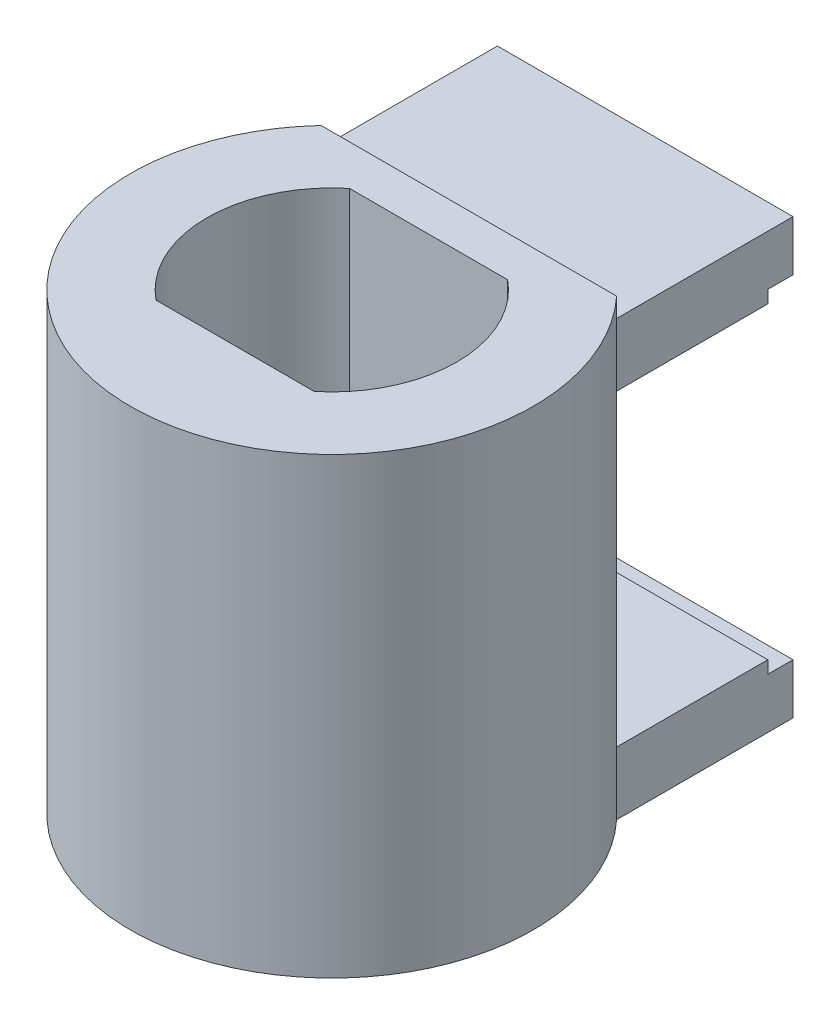
ISO-10303-21;
HEADER;
FILE_DESCRIPTION(('STEP AP214'),'2;1');
FILE_NAME('part.step','',(''),(''),'','','');
FILE_SCHEMA(('AUTOMOTIVE_DESIGN { 1 0 10303 214 1 1 1 1 }'));
ENDSEC;
DATA;
#1=APPLICATION_CONTEXT('core data for automotive mechanical design processes');
#2=APPLICATION_PROTOCOL_DEFINITION('international standard','automotive_design',2000,#1);
#3=PRODUCT_CONTEXT('',#1,'mechanical');
#4=PRODUCT('Part','Part','',(#3));
#5=PRODUCT_RELATED_PRODUCT_CATEGORY('part','',(#4));
#6=PRODUCT_DEFINITION_FORMATION('','',#4);
#7=PRODUCT_DEFINITION_CONTEXT('part definition',#1,'design');
#8=PRODUCT_DEFINITION('design','',#6,#7);
#9=PRODUCT_DEFINITION_SHAPE('','',#8);
#10=(LENGTH_UNIT() NAMED_UNIT(*) SI_UNIT(.MILLI.,.METRE.));
#11=(NAMED_UNIT(*) PLANE_ANGLE_UNIT() SI_UNIT($,.RADIAN.));
#12=(NAMED_UNIT(*) SI_UNIT($,.STERADIAN.) SOLID_ANGLE_UNIT());
#13=UNCERTAINTY_MEASURE_WITH_UNIT(LENGTH_MEASURE(1.E-05),#10,'distance_accuracy_value','');
#14=(GEOMETRIC_REPRESENTATION_CONTEXT(3) GLOBAL_UNCERTAINTY_ASSIGNED_CONTEXT((#13)) GLOBAL_UNIT_ASSIGNED_CONTEXT((#10,
#11,#12)) REPRESENTATION_CONTEXT('',''));
#15=CARTESIAN_POINT('',(0.,0.,0.));
#16=DIRECTION('',(0.,0.,1.));
#17=DIRECTION('',(1.,0.,0.));
#18=AXIS2_PLACEMENT_3D('',#15,#16,#17);
#19=CARTESIAN_POINT('',(0.,0.,-8.636));
#20=DIRECTION('',(0.,0.,-1.));
#21=DIRECTION('',(-1.,0.,0.));
#22=AXIS2_PLACEMENT_3D('',#19,#20,#21);
#23=PLANE('',#22);
#24=DIRECTION('',(0.,-1.,0.));
#25=VECTOR('',#24,1.);
#26=CARTESIAN_POINT('',(-9.31179381215027,9.525,-8.636));
#27=LINE('',#26,#25);
#28=CARTESIAN_POINT('',(-9.31179381215027,3.96875,-8.636));
#29=VERTEX_POINT('',#28);
#30=CARTESIAN_POINT('',(-9.31179381215027,23.38705,-8.636));
#31=VERTEX_POINT('',#30);
#32=EDGE_CURVE('E292',#29,#31,#27,.F.);
#33=ORIENTED_EDGE('',*,*,#32,.T.);
#34=DIRECTION('',(-1.,0.,0.));
#35=VECTOR('',#34,1.);
#36=CARTESIAN_POINT('',(9.31179381215027,23.38705,-8.636));
#37=LINE('',#36,#35);
#38=CARTESIAN_POINT('',(9.31179381215027,23.38705,-8.636));
#39=VERTEX_POINT('',#38);
#40=EDGE_CURVE('E183',#39,#31,#37,.T.);
#41=ORIENTED_EDGE('',*,*,#40,.F.);
#42=DIRECTION('',(0.,-1.,0.));
#43=VECTOR('',#42,1.);
#44=CARTESIAN_POINT('',(9.31179381215027,9.525,-8.636));
#45=LINE('',#44,#43);
#46=CARTESIAN_POINT('',(9.31179381215027,3.96875,-8.636));
#47=VERTEX_POINT('',#46);
#48=EDGE_CURVE('E55',#39,#47,#45,.T.);
#49=ORIENTED_EDGE('',*,*,#48,.T.);
#50=DIRECTION('',(1.,0.,0.));
#51=VECTOR('',#50,1.);
#52=CARTESIAN_POINT('',(9.31179381215027,3.96875,-8.636));
#53=LINE('',#52,#51);
#54=EDGE_CURVE('E189',#29,#47,#53,.T.);
#55=ORIENTED_EDGE('',*,*,#54,.F.);
#56=EDGE_LOOP('',(#33,#41,#49,#55));
#57=FACE_BOUND('',#56,.T.);
#58=ADVANCED_FACE('F39',(#57),#23,.T.);
#59=CARTESIAN_POINT('',(9.31179381215027,3.175,-19.7485));
#60=DIRECTION('',(0.,-1.,0.));
#61=DIRECTION('',(0.,0.,-1.));
#62=AXIS2_PLACEMENT_3D('',#59,#60,#61);
#63=PLANE('',#62);
#64=DIRECTION('',(-1.,0.,0.));
#65=VECTOR('',#64,1.);
#66=CARTESIAN_POINT('',(9.31179381215027,3.175,-18.161));
#67=LINE('',#66,#65);
#68=CARTESIAN_POINT('',(9.31179381215027,3.175,-18.161));
#69=VERTEX_POINT('',#68);
#70=CARTESIAN_POINT('',(-9.31179381215027,3.175,-18.161));
#71=VERTEX_POINT('',#70);
#72=EDGE_CURVE('E202',#69,#71,#67,.T.);
#73=ORIENTED_EDGE('',*,*,#72,.F.);
#74=DIRECTION('',(0.,0.,1.));
#75=VECTOR('',#74,1.);
#76=CARTESIAN_POINT('',(9.31179381215027,3.175,-19.7485));
#77=LINE('',#76,#75);
#78=CARTESIAN_POINT('',(9.31179381215027,3.175,-19.7485));
#79=VERTEX_POINT('',#78);
#80=EDGE_CURVE('E269',#79,#69,#77,.T.);
#81=ORIENTED_EDGE('',*,*,#80,.F.);
#82=DIRECTION('',(1.,0.,0.));
#83=VECTOR('',#82,1.);
#84=CARTESIAN_POINT('',(9.31179381215027,3.175,-19.7485));
#85=LINE('',#84,#83);
#86=CARTESIAN_POINT('',(-9.31179381215027,3.175,-19.7485));
#87=VERTEX_POINT('',#86);
#88=EDGE_CURVE('E266',#87,#79,#85,.T.);
#89=ORIENTED_EDGE('',*,*,#88,.F.);
#90=DIRECTION('',(0.,0.,1.));
#91=VECTOR('',#90,1.);
#92=CARTESIAN_POINT('',(-9.31179381215027,3.175,-19.7485));
#93=LINE('',#92,#91);
#94=EDGE_CURVE('E276',#87,#71,#93,.T.);
#95=ORIENTED_EDGE('',*,*,#94,.T.);
#96=EDGE_LOOP('',(#73,#81,#89,#95));
#97=FACE_BOUND('',#96,.T.);
#98=ADVANCED_FACE('F409',(#97),#63,.F.);
#99=CARTESIAN_POINT('',(9.31179381215027,28.575,-8.636));
#100=VERTEX_POINT('',#99);
#101=CARTESIAN_POINT('',(9.31179381215027,27.3558,-8.636));
#102=VERTEX_POINT('',#101);
#103=EDGE_CURVE('E293',#100,#102,#45,.T.);
#104=ORIENTED_EDGE('',*,*,#103,.T.);
#105=DIRECTION('',(1.,0.,0.));
#106=VECTOR('',#105,1.);
#107=CARTESIAN_POINT('',(9.31179381215027,27.3558,-8.636));
#108=LINE('',#107,#106);
#109=CARTESIAN_POINT('',(-9.31179381215027,27.3558,-8.636));
#110=VERTEX_POINT('',#109);
#111=EDGE_CURVE('E226',#110,#102,#108,.T.);
#112=ORIENTED_EDGE('',*,*,#111,.F.);
#113=CARTESIAN_POINT('',(-9.31179381215027,28.575,-8.636));
#114=VERTEX_POINT('',#113);
#115=EDGE_CURVE('E289',#110,#114,#27,.F.);
#116=ORIENTED_EDGE('',*,*,#115,.T.);
#117=DIRECTION('',(-1.,0.,0.));
#118=VECTOR('',#117,1.);
#119=CARTESIAN_POINT('',(0.,28.575,-8.636));
#120=LINE('',#119,#118);
#121=EDGE_CURVE('E11',#100,#114,#120,.T.);
#122=ORIENTED_EDGE('',*,*,#121,.F.);
#123=EDGE_LOOP('',(#104,#112,#116,#122));
#124=FACE_BOUND('',#123,.T.);
#125=ADVANCED_FACE('F411',(#124),#23,.T.);
#126=CARTESIAN_POINT('',(0.,9.525,0.));
#127=DIRECTION('',(0.,-1.,0.));
#128=DIRECTION('',(0.,0.,-1.));
#129=AXIS2_PLACEMENT_3D('',#126,#127,#128);
#130=CYLINDRICAL_SURFACE('',#129,12.7);
#131=ORIENTED_EDGE('',*,*,#103,.F.);
#132=CARTESIAN_POINT('',(0.,28.575,0.));
#133=DIRECTION('',(0.,1.,0.));
#134=DIRECTION('',(0.,0.,1.));
#135=AXIS2_PLACEMENT_3D('',#132,#133,#134);
#136=CIRCLE('',#135,12.7);
#137=EDGE_CURVE('E355',#114,#100,#136,.T.);
#138=ORIENTED_EDGE('',*,*,#137,.F.);
#139=ORIENTED_EDGE('',*,*,#115,.F.);
#140=DIRECTION('',(0.,1.,0.));
#141=VECTOR('',#140,1.);
#142=CARTESIAN_POINT('',(-9.31179381215027,27.3558,-8.636));
#143=LINE('',#142,#141);
#144=EDGE_CURVE('E220',#31,#110,#143,.T.);
#145=ORIENTED_EDGE('',*,*,#144,.F.);
#146=ORIENTED_EDGE('',*,*,#32,.F.);
#147=CARTESIAN_POINT('',(-9.31179381215027,0.,-8.636));
#148=VERTEX_POINT('',#147);
#149=EDGE_CURVE('E63',#148,#29,#27,.F.);
#150=ORIENTED_EDGE('',*,*,#149,.F.);
#151=CARTESIAN_POINT('',(0.,0.,0.));
#152=DIRECTION('',(0.,1.,0.));
#153=DIRECTION('',(0.,0.,1.));
#154=AXIS2_PLACEMENT_3D('',#151,#152,#153);
#155=CIRCLE('',#154,12.7);
#156=CARTESIAN_POINT('',(9.31179381215027,0.,-8.636));
#157=VERTEX_POINT('',#156);
#158=EDGE_CURVE('E285',#148,#157,#155,.T.);
#159=ORIENTED_EDGE('',*,*,#158,.T.);
#160=DIRECTION('',(0.,-1.,0.));
#161=VECTOR('',#160,1.);
#162=CARTESIAN_POINT('',(9.31179381215027,0.,-8.636));
#163=LINE('',#162,#161);
#164=EDGE_CURVE('E255',#47,#157,#163,.T.);
#165=ORIENTED_EDGE('',*,*,#164,.F.);
#166=ORIENTED_EDGE('',*,*,#48,.F.);
#167=EDGE_CURVE('E187',#102,#39,#45,.T.);
#168=ORIENTED_EDGE('',*,*,#167,.F.);
#169=EDGE_LOOP('',(#131,#138,#139,#145,#146,#150,#159,#165,#166,#168));
#170=FACE_BOUND('',#169,.T.);
#171=ADVANCED_FACE('F421',(#170),#130,.T.);
#172=CARTESIAN_POINT('',(0.,28.575,0.));
#173=DIRECTION('',(0.,1.,0.));
#174=DIRECTION('',(0.,0.,1.));
#175=AXIS2_PLACEMENT_3D('',#172,#173,#174);
#176=PLANE('',#175);
#177=DIRECTION('',(1.,0.,0.));
#178=VECTOR('',#177,1.);
#179=CARTESIAN_POINT('',(-4.98383988506854,28.575,6.096));
#180=LINE('',#179,#178);
#181=CARTESIAN_POINT('',(-4.98383988506854,28.575,6.096));
#182=VERTEX_POINT('',#181);
#183=CARTESIAN_POINT('',(4.98383988506854,28.575,6.096));
#184=VERTEX_POINT('',#183);
#185=EDGE_CURVE('E317',#182,#184,#180,.T.);
#186=ORIENTED_EDGE('',*,*,#185,.F.);
#187=CARTESIAN_POINT('',(0.,28.575,0.));
#188=DIRECTION('',(0.,1.,0.));
#189=DIRECTION('',(0.,0.,1.));
#190=AXIS2_PLACEMENT_3D('',#187,#188,#189);
#191=CIRCLE('',#190,7.874);
#192=CARTESIAN_POINT('',(-4.98383988506854,28.575,-6.096));
#193=VERTEX_POINT('',#192);
#194=EDGE_CURVE('E314',#193,#182,#191,.T.);
#195=ORIENTED_EDGE('',*,*,#194,.F.);
#196=DIRECTION('',(-1.,0.,0.));
#197=VECTOR('',#196,1.);
#198=CARTESIAN_POINT('',(-4.98383988506854,28.575,-6.096));
#199=LINE('',#198,#197);
#200=CARTESIAN_POINT('',(4.98383988506854,28.575,-6.096));
#201=VERTEX_POINT('',#200);
#202=EDGE_CURVE('E325',#201,#193,#199,.T.);
#203=ORIENTED_EDGE('',*,*,#202,.F.);
#204=CARTESIAN_POINT('',(0.,28.575,0.));
#205=DIRECTION('',(0.,1.,0.));
#206=DIRECTION('',(0.,0.,1.));
#207=AXIS2_PLACEMENT_3D('',#204,#205,#206);
#208=CIRCLE('',#207,7.874);
#209=EDGE_CURVE('E321',#184,#201,#208,.T.);
#210=ORIENTED_EDGE('',*,*,#209,.F.);
#211=EDGE_LOOP('',(#186,#195,#203,#210));
#212=FACE_BOUND('',#211,.T.);
#213=ORIENTED_EDGE('',*,*,#137,.T.);
#214=ORIENTED_EDGE('',*,*,#121,.T.);
#215=EDGE_LOOP('',(#213,#214));
#216=FACE_BOUND('',#215,.T.);
#217=ADVANCED_FACE('F377',(#212,#216),#176,.T.);
#218=CARTESIAN_POINT('',(0.,9.525,0.));
#219=DIRECTION('',(0.,1.,0.));
#220=DIRECTION('',(0.,0.,1.));
#221=AXIS2_PLACEMENT_3D('',#218,#219,#220);
#222=PLANE('',#221);
#223=CARTESIAN_POINT('',(-4.39940905122495,9.525,-0.635));
#224=DIRECTION('',(0.,1.,0.));
#225=DIRECTION('',(0.,0.,1.));
#226=AXIS2_PLACEMENT_3D('',#223,#224,#225);
#227=CIRCLE('',#226,1.143);
#228=CARTESIAN_POINT('',(-4.39940905122495,9.525,0.508));
#229=VERTEX_POINT('',#228);
#230=EDGE_CURVE('E309',#229,#229,#227,.T.);
#231=ORIENTED_EDGE('',*,*,#230,.F.);
#232=EDGE_LOOP('',(#231));
#233=FACE_BOUND('',#232,.T.);
#234=CARTESIAN_POINT('',(4.39940905122495,9.525,0.634999999999968));
#235=DIRECTION('',(0.,1.,0.));
#236=DIRECTION('',(0.,0.,1.));
#237=AXIS2_PLACEMENT_3D('',#234,#235,#236);
#238=CIRCLE('',#237,1.143);
#239=CARTESIAN_POINT('',(4.39940905122495,9.525,1.77799999999997));
#240=VERTEX_POINT('',#239);
#241=EDGE_CURVE('E302',#240,#240,#238,.T.);
#242=ORIENTED_EDGE('',*,*,#241,.F.);
#243=EDGE_LOOP('',(#242));
#244=FACE_BOUND('',#243,.T.);
#245=CARTESIAN_POINT('',(0.,9.525,0.));
#246=DIRECTION('',(0.,1.,0.));
#247=DIRECTION('',(0.,0.,1.));
#248=AXIS2_PLACEMENT_3D('',#245,#246,#247);
#249=CIRCLE('',#248,2.9718);
#250=CARTESIAN_POINT('',(0.,9.525,2.9718));
#251=VERTEX_POINT('',#250);
#252=EDGE_CURVE('E359',#251,#251,#249,.T.);
#253=ORIENTED_EDGE('',*,*,#252,.F.);
#254=EDGE_LOOP('',(#253));
#255=FACE_BOUND('',#254,.T.);
#256=DIRECTION('',(-1.,0.,0.));
#257=VECTOR('',#256,1.);
#258=CARTESIAN_POINT('',(-4.98383988506854,9.525,-6.096));
#259=LINE('',#258,#257);
#260=CARTESIAN_POINT('',(4.98383988506854,9.525,-6.096));
#261=VERTEX_POINT('',#260);
#262=CARTESIAN_POINT('',(-4.98383988506854,9.525,-6.096));
#263=VERTEX_POINT('',#262);
#264=EDGE_CURVE('E318',#261,#263,#259,.T.);
#265=ORIENTED_EDGE('',*,*,#264,.T.);
#266=CARTESIAN_POINT('',(0.,9.525,0.));
#267=DIRECTION('',(0.,1.,0.));
#268=DIRECTION('',(0.,0.,1.));
#269=AXIS2_PLACEMENT_3D('',#266,#267,#268);
#270=CIRCLE('',#269,7.874);
#271=CARTESIAN_POINT('',(-4.98383988506854,9.525,6.096));
#272=VERTEX_POINT('',#271);
#273=EDGE_CURVE('E313',#263,#272,#270,.T.);
#274=ORIENTED_EDGE('',*,*,#273,.T.);
#275=DIRECTION('',(1.,0.,0.));
#276=VECTOR('',#275,1.);
#277=CARTESIAN_POINT('',(-4.98383988506854,9.525,6.096));
#278=LINE('',#277,#276);
#279=CARTESIAN_POINT('',(4.98383988506854,9.525,6.096));
#280=VERTEX_POINT('',#279);
#281=EDGE_CURVE('E332',#272,#280,#278,.T.);
#282=ORIENTED_EDGE('',*,*,#281,.T.);
#283=CARTESIAN_POINT('',(0.,9.525,0.));
#284=DIRECTION('',(0.,1.,0.));
#285=DIRECTION('',(0.,0.,1.));
#286=AXIS2_PLACEMENT_3D('',#283,#284,#285);
#287=CIRCLE('',#286,7.874);
#288=EDGE_CURVE('E336',#280,#261,#287,.T.);
#289=ORIENTED_EDGE('',*,*,#288,.T.);
#290=EDGE_LOOP('',(#265,#274,#282,#289));
#291=FACE_BOUND('',#290,.T.);
#292=ADVANCED_FACE('F374',(#233,#244,#255,#291),#222,.T.);
#293=CARTESIAN_POINT('',(0.,0.,0.));
#294=DIRECTION('',(0.,1.,0.));
#295=DIRECTION('',(0.,0.,1.));
#296=AXIS2_PLACEMENT_3D('',#293,#294,#295);
#297=PLANE('',#296);
#298=CARTESIAN_POINT('',(-4.39940905122495,0.,-0.635));
#299=DIRECTION('',(0.,-1.,0.));
#300=DIRECTION('',(0.,0.,-1.));
#301=AXIS2_PLACEMENT_3D('',#298,#299,#300);
#302=CIRCLE('',#301,1.143);
#303=CARTESIAN_POINT('',(-4.39940905122495,0.,-1.778));
#304=VERTEX_POINT('',#303);
#305=EDGE_CURVE('E298',#304,#304,#302,.T.);
#306=ORIENTED_EDGE('',*,*,#305,.F.);
#307=EDGE_LOOP('',(#306));
#308=FACE_BOUND('',#307,.T.);
#309=CARTESIAN_POINT('',(4.39940905122495,0.,0.634999999999968));
#310=DIRECTION('',(0.,-1.,0.));
#311=DIRECTION('',(0.,0.,-1.));
#312=AXIS2_PLACEMENT_3D('',#309,#310,#311);
#313=CIRCLE('',#312,1.143);
#314=CARTESIAN_POINT('',(4.39940905122495,0.,-0.508000000000032));
#315=VERTEX_POINT('',#314);
#316=EDGE_CURVE('E297',#315,#315,#313,.T.);
#317=ORIENTED_EDGE('',*,*,#316,.F.);
#318=EDGE_LOOP('',(#317));
#319=FACE_BOUND('',#318,.T.);
#320=CARTESIAN_POINT('',(0.,0.,0.));
#321=DIRECTION('',(0.,1.,0.));
#322=DIRECTION('',(0.,0.,1.));
#323=AXIS2_PLACEMENT_3D('',#320,#321,#322);
#324=CIRCLE('',#323,2.9718);
#325=CARTESIAN_POINT('',(0.,0.,2.9718));
#326=VERTEX_POINT('',#325);
#327=EDGE_CURVE('E48',#326,#326,#324,.T.);
#328=ORIENTED_EDGE('',*,*,#327,.T.);
#329=EDGE_LOOP('',(#328));
#330=FACE_BOUND('',#329,.T.);
#331=ORIENTED_EDGE('',*,*,#158,.F.);
#332=DIRECTION('',(0.,0.,1.));
#333=VECTOR('',#332,1.);
#334=CARTESIAN_POINT('',(-9.31179381215027,0.,-19.7485));
#335=LINE('',#334,#333);
#336=CARTESIAN_POINT('',(-9.31179381215027,0.,-19.7485));
#337=VERTEX_POINT('',#336);
#338=EDGE_CURVE('E279',#337,#148,#335,.T.);
#339=ORIENTED_EDGE('',*,*,#338,.F.);
#340=DIRECTION('',(-1.,0.,0.));
#341=VECTOR('',#340,1.);
#342=CARTESIAN_POINT('',(9.31179381215027,0.,-19.7485));
#343=LINE('',#342,#341);
#344=CARTESIAN_POINT('',(9.31179381215027,0.,-19.7485));
#345=VERTEX_POINT('',#344);
#346=EDGE_CURVE('E260',#345,#337,#343,.T.);
#347=ORIENTED_EDGE('',*,*,#346,.F.);
#348=DIRECTION('',(0.,0.,1.));
#349=VECTOR('',#348,1.);
#350=CARTESIAN_POINT('',(9.31179381215027,0.,-19.7485));
#351=LINE('',#350,#349);
#352=EDGE_CURVE('E282',#345,#157,#351,.T.);
#353=ORIENTED_EDGE('',*,*,#352,.T.);
#354=EDGE_LOOP('',(#331,#339,#347,#353));
#355=FACE_BOUND('',#354,.T.);
#356=ADVANCED_FACE('F41',(#308,#319,#330,#355),#297,.F.);
#357=CARTESIAN_POINT('',(0.,6.35,0.));
#358=DIRECTION('',(0.,-1.,0.));
#359=DIRECTION('',(0.,0.,-1.));
#360=AXIS2_PLACEMENT_3D('',#357,#358,#359);
#361=CYLINDRICAL_SURFACE('',#360,2.9718);
#362=ORIENTED_EDGE('',*,*,#327,.F.);
#363=EDGE_LOOP('',(#362));
#364=FACE_BOUND('',#363,.T.);
#365=ORIENTED_EDGE('',*,*,#252,.T.);
#366=EDGE_LOOP('',(#365));
#367=FACE_BOUND('',#366,.T.);
#368=ADVANCED_FACE('F368',(#364,#367),#361,.F.);
#369=CARTESIAN_POINT('',(0.,28.575,0.));
#370=DIRECTION('',(0.,-1.,0.));
#371=DIRECTION('',(0.,0.,-1.));
#372=AXIS2_PLACEMENT_3D('',#369,#370,#371);
#373=CYLINDRICAL_SURFACE('',#372,7.874);
#374=ORIENTED_EDGE('',*,*,#273,.F.);
#375=DIRECTION('',(0.,-1.,0.));
#376=VECTOR('',#375,1.);
#377=CARTESIAN_POINT('',(-4.98383988506854,28.575,-6.096));
#378=LINE('',#377,#376);
#379=EDGE_CURVE('E328',#193,#263,#378,.T.);
#380=ORIENTED_EDGE('',*,*,#379,.F.);
#381=ORIENTED_EDGE('',*,*,#194,.T.);
#382=DIRECTION('',(0.,-1.,0.));
#383=VECTOR('',#382,1.);
#384=CARTESIAN_POINT('',(-4.98383988506854,28.575,6.096));
#385=LINE('',#384,#383);
#386=EDGE_CURVE('E351',#182,#272,#385,.T.);
#387=ORIENTED_EDGE('',*,*,#386,.T.);
#388=EDGE_LOOP('',(#374,#380,#381,#387));
#389=FACE_BOUND('',#388,.T.);
#390=ADVANCED_FACE('F371',(#389),#373,.F.);
#391=CARTESIAN_POINT('',(-4.98383988506854,28.575,6.096));
#392=DIRECTION('',(0.,0.,-1.));
#393=DIRECTION('',(-1.,0.,0.));
#394=AXIS2_PLACEMENT_3D('',#391,#392,#393);
#395=PLANE('',#394);
#396=ORIENTED_EDGE('',*,*,#281,.F.);
#397=ORIENTED_EDGE('',*,*,#386,.F.);
#398=ORIENTED_EDGE('',*,*,#185,.T.);
#399=DIRECTION('',(0.,-1.,0.));
#400=VECTOR('',#399,1.);
#401=CARTESIAN_POINT('',(4.98383988506854,28.575,6.096));
#402=LINE('',#401,#400);
#403=EDGE_CURVE('E348',#184,#280,#402,.T.);
#404=ORIENTED_EDGE('',*,*,#403,.T.);
#405=EDGE_LOOP('',(#396,#397,#398,#404));
#406=FACE_BOUND('',#405,.T.);
#407=ADVANCED_FACE('F392',(#406),#395,.T.);
#408=CARTESIAN_POINT('',(0.,28.575,0.));
#409=DIRECTION('',(0.,-1.,0.));
#410=DIRECTION('',(0.,0.,-1.));
#411=AXIS2_PLACEMENT_3D('',#408,#409,#410);
#412=CYLINDRICAL_SURFACE('',#411,7.874);
#413=ORIENTED_EDGE('',*,*,#288,.F.);
#414=ORIENTED_EDGE('',*,*,#403,.F.);
#415=ORIENTED_EDGE('',*,*,#209,.T.);
#416=DIRECTION('',(0.,-1.,0.));
#417=VECTOR('',#416,1.);
#418=CARTESIAN_POINT('',(4.98383988506854,28.575,-6.096));
#419=LINE('',#418,#417);
#420=EDGE_CURVE('E345',#201,#261,#419,.T.);
#421=ORIENTED_EDGE('',*,*,#420,.T.);
#422=EDGE_LOOP('',(#413,#414,#415,#421));
#423=FACE_BOUND('',#422,.T.);
#424=ADVANCED_FACE('F398',(#423),#412,.F.);
#425=CARTESIAN_POINT('',(-4.98383988506854,28.575,-6.096));
#426=DIRECTION('',(0.,0.,1.));
#427=DIRECTION('',(1.,0.,0.));
#428=AXIS2_PLACEMENT_3D('',#425,#426,#427);
#429=PLANE('',#428);
#430=ORIENTED_EDGE('',*,*,#264,.F.);
#431=ORIENTED_EDGE('',*,*,#420,.F.);
#432=ORIENTED_EDGE('',*,*,#202,.T.);
#433=ORIENTED_EDGE('',*,*,#379,.T.);
#434=EDGE_LOOP('',(#430,#431,#432,#433));
#435=FACE_BOUND('',#434,.T.);
#436=ADVANCED_FACE('F384',(#435),#429,.T.);
#437=CARTESIAN_POINT('',(4.39940905122495,28.575,0.634999999999968));
#438=DIRECTION('',(0.,-1.,0.));
#439=DIRECTION('',(0.,0.,-1.));
#440=AXIS2_PLACEMENT_3D('',#437,#438,#439);
#441=CYLINDRICAL_SURFACE('',#440,1.143);
#442=ORIENTED_EDGE('',*,*,#241,.T.);
#443=EDGE_LOOP('',(#442));
#444=FACE_BOUND('',#443,.T.);
#445=ORIENTED_EDGE('',*,*,#316,.T.);
#446=EDGE_LOOP('',(#445));
#447=FACE_BOUND('',#446,.T.);
#448=ADVANCED_FACE('F405',(#444,#447),#441,.F.);
#449=CARTESIAN_POINT('',(-4.39940905122495,28.575,-0.635));
#450=DIRECTION('',(0.,-1.,0.));
#451=DIRECTION('',(0.,0.,-1.));
#452=AXIS2_PLACEMENT_3D('',#449,#450,#451);
#453=CYLINDRICAL_SURFACE('',#452,1.143);
#454=ORIENTED_EDGE('',*,*,#305,.T.);
#455=EDGE_LOOP('',(#454));
#456=FACE_BOUND('',#455,.T.);
#457=ORIENTED_EDGE('',*,*,#230,.T.);
#458=EDGE_LOOP('',(#457));
#459=FACE_BOUND('',#458,.T.);
#460=ADVANCED_FACE('F469',(#456,#459),#453,.F.);
#461=CARTESIAN_POINT('',(9.31179381215027,0.,-19.7485));
#462=DIRECTION('',(-1.,0.,0.));
#463=DIRECTION('',(0.,0.,1.));
#464=AXIS2_PLACEMENT_3D('',#461,#462,#463);
#465=PLANE('',#464);
#466=ORIENTED_EDGE('',*,*,#164,.T.);
#467=ORIENTED_EDGE('',*,*,#352,.F.);
#468=DIRECTION('',(0.,-1.,0.));
#469=VECTOR('',#468,1.);
#470=CARTESIAN_POINT('',(9.31179381215027,0.,-19.7485));
#471=LINE('',#470,#469);
#472=EDGE_CURVE('E256',#79,#345,#471,.T.);
#473=ORIENTED_EDGE('',*,*,#472,.F.);
#474=ORIENTED_EDGE('',*,*,#80,.T.);
#475=DIRECTION('',(0.,-1.,0.));
#476=VECTOR('',#475,1.);
#477=CARTESIAN_POINT('',(9.31179381215027,3.175,-18.161));
#478=LINE('',#477,#476);
#479=CARTESIAN_POINT('',(9.31179381215027,3.96875,-18.161));
#480=VERTEX_POINT('',#479);
#481=EDGE_CURVE('E194',#480,#69,#478,.T.);
#482=ORIENTED_EDGE('',*,*,#481,.F.);
#483=DIRECTION('',(0.,0.,1.));
#484=VECTOR('',#483,1.);
#485=CARTESIAN_POINT('',(9.31179381215027,3.96875,-18.161));
#486=LINE('',#485,#484);
#487=EDGE_CURVE('E211',#480,#47,#486,.T.);
#488=ORIENTED_EDGE('',*,*,#487,.T.);
#489=EDGE_LOOP('',(#466,#467,#473,#474,#482,#488));
#490=FACE_BOUND('',#489,.T.);
#491=ADVANCED_FACE('F467',(#490),#465,.F.);
#492=CARTESIAN_POINT('',(-9.31179381215027,0.,-19.7485));
#493=DIRECTION('',(1.,0.,0.));
#494=DIRECTION('',(0.,0.,-1.));
#495=AXIS2_PLACEMENT_3D('',#492,#493,#494);
#496=PLANE('',#495);
#497=ORIENTED_EDGE('',*,*,#149,.T.);
#498=DIRECTION('',(0.,0.,1.));
#499=VECTOR('',#498,1.);
#500=CARTESIAN_POINT('',(-9.31179381215027,3.96875,-18.161));
#501=LINE('',#500,#499);
#502=CARTESIAN_POINT('',(-9.31179381215027,3.96875,-18.161));
#503=VERTEX_POINT('',#502);
#504=EDGE_CURVE('E216',#503,#29,#501,.T.);
#505=ORIENTED_EDGE('',*,*,#504,.F.);
#506=DIRECTION('',(0.,1.,0.));
#507=VECTOR('',#506,1.);
#508=CARTESIAN_POINT('',(-9.31179381215027,3.175,-18.161));
#509=LINE('',#508,#507);
#510=EDGE_CURVE('E206',#71,#503,#509,.T.);
#511=ORIENTED_EDGE('',*,*,#510,.F.);
#512=ORIENTED_EDGE('',*,*,#94,.F.);
#513=DIRECTION('',(0.,1.,0.));
#514=VECTOR('',#513,1.);
#515=CARTESIAN_POINT('',(-9.31179381215027,0.,-19.7485));
#516=LINE('',#515,#514);
#517=EDGE_CURVE('E263',#337,#87,#516,.T.);
#518=ORIENTED_EDGE('',*,*,#517,.F.);
#519=ORIENTED_EDGE('',*,*,#338,.T.);
#520=EDGE_LOOP('',(#497,#505,#511,#512,#518,#519));
#521=FACE_BOUND('',#520,.T.);
#522=ADVANCED_FACE('F463',(#521),#496,.F.);
#523=CARTESIAN_POINT('',(0.,0.,-19.7485));
#524=DIRECTION('',(0.,0.,1.));
#525=DIRECTION('',(1.,0.,0.));
#526=AXIS2_PLACEMENT_3D('',#523,#524,#525);
#527=PLANE('',#526);
#528=ORIENTED_EDGE('',*,*,#472,.T.);
#529=ORIENTED_EDGE('',*,*,#346,.T.);
#530=ORIENTED_EDGE('',*,*,#517,.T.);
#531=ORIENTED_EDGE('',*,*,#88,.T.);
#532=EDGE_LOOP('',(#528,#529,#530,#531));
#533=FACE_BOUND('',#532,.T.);
#534=ADVANCED_FACE('F458',(#533),#527,.F.);
#535=CARTESIAN_POINT('',(9.31179381215027,27.3558,-19.7485));
#536=DIRECTION('',(-1.,0.,0.));
#537=DIRECTION('',(0.,0.,1.));
#538=AXIS2_PLACEMENT_3D('',#535,#536,#537);
#539=PLANE('',#538);
#540=DIRECTION('',(0.,0.,1.));
#541=VECTOR('',#540,1.);
#542=CARTESIAN_POINT('',(9.31179381215027,27.3558,-19.7485));
#543=LINE('',#542,#541);
#544=CARTESIAN_POINT('',(9.31179381215027,27.3558,-19.7485));
#545=VERTEX_POINT('',#544);
#546=EDGE_CURVE('E235',#545,#102,#543,.T.);
#547=ORIENTED_EDGE('',*,*,#546,.T.);
#548=ORIENTED_EDGE('',*,*,#167,.T.);
#549=DIRECTION('',(0.,0.,1.));
#550=VECTOR('',#549,1.);
#551=CARTESIAN_POINT('',(9.31179381215027,23.38705,-18.161));
#552=LINE('',#551,#550);
#553=CARTESIAN_POINT('',(9.31179381215027,23.38705,-18.161));
#554=VERTEX_POINT('',#553);
#555=EDGE_CURVE('E165',#554,#39,#552,.T.);
#556=ORIENTED_EDGE('',*,*,#555,.F.);
#557=DIRECTION('',(0.,-1.,0.));
#558=VECTOR('',#557,1.);
#559=CARTESIAN_POINT('',(9.31179381215027,24.1808,-18.161));
#560=LINE('',#559,#558);
#561=CARTESIAN_POINT('',(9.31179381215027,24.1808,-18.161));
#562=VERTEX_POINT('',#561);
#563=EDGE_CURVE('E173',#562,#554,#560,.T.);
#564=ORIENTED_EDGE('',*,*,#563,.F.);
#565=DIRECTION('',(0.,0.,1.));
#566=VECTOR('',#565,1.);
#567=CARTESIAN_POINT('',(9.31179381215027,24.1808,-19.7485));
#568=LINE('',#567,#566);
#569=CARTESIAN_POINT('',(9.31179381215027,24.1808,-19.7485));
#570=VERTEX_POINT('',#569);
#571=EDGE_CURVE('E252',#570,#562,#568,.T.);
#572=ORIENTED_EDGE('',*,*,#571,.F.);
#573=DIRECTION('',(0.,-1.,0.));
#574=VECTOR('',#573,1.);
#575=CARTESIAN_POINT('',(9.31179381215027,27.3558,-19.7485));
#576=LINE('',#575,#574);
#577=EDGE_CURVE('E221',#545,#570,#576,.T.);
#578=ORIENTED_EDGE('',*,*,#577,.F.);
#579=EDGE_LOOP('',(#547,#548,#556,#564,#572,#578));
#580=FACE_BOUND('',#579,.T.);
#581=ADVANCED_FACE('F186',(#580),#539,.F.);
#582=CARTESIAN_POINT('',(9.31179381215027,24.1808,-19.7485));
#583=DIRECTION('',(0.,1.,0.));
#584=DIRECTION('',(0.,0.,1.));
#585=AXIS2_PLACEMENT_3D('',#582,#583,#584);
#586=PLANE('',#585);
#587=ORIENTED_EDGE('',*,*,#571,.T.);
#588=DIRECTION('',(1.,0.,0.));
#589=VECTOR('',#588,1.);
#590=CARTESIAN_POINT('',(9.31179381215027,24.1808,-18.161));
#591=LINE('',#590,#589);
#592=CARTESIAN_POINT('',(-9.31179381215027,24.1808,-18.161));
#593=VERTEX_POINT('',#592);
#594=EDGE_CURVE('E178',#593,#562,#591,.T.);
#595=ORIENTED_EDGE('',*,*,#594,.F.);
#596=DIRECTION('',(0.,0.,1.));
#597=VECTOR('',#596,1.);
#598=CARTESIAN_POINT('',(-9.31179381215027,24.1808,-19.7485));
#599=LINE('',#598,#597);
#600=CARTESIAN_POINT('',(-9.31179381215027,24.1808,-19.7485));
#601=VERTEX_POINT('',#600);
#602=EDGE_CURVE('E248',#601,#593,#599,.T.);
#603=ORIENTED_EDGE('',*,*,#602,.F.);
#604=DIRECTION('',(-1.,0.,0.));
#605=VECTOR('',#604,1.);
#606=CARTESIAN_POINT('',(9.31179381215027,24.1808,-19.7485));
#607=LINE('',#606,#605);
#608=EDGE_CURVE('E225',#570,#601,#607,.T.);
#609=ORIENTED_EDGE('',*,*,#608,.F.);
#610=EDGE_LOOP('',(#587,#595,#603,#609));
#611=FACE_BOUND('',#610,.T.);
#612=ADVANCED_FACE('F450',(#611),#586,.F.);
#613=CARTESIAN_POINT('',(-9.31179381215027,27.3558,-19.7485));
#614=DIRECTION('',(1.,0.,0.));
#615=DIRECTION('',(0.,0.,-1.));
#616=AXIS2_PLACEMENT_3D('',#613,#614,#615);
#617=PLANE('',#616);
#618=ORIENTED_EDGE('',*,*,#144,.T.);
#619=DIRECTION('',(0.,0.,1.));
#620=VECTOR('',#619,1.);
#621=CARTESIAN_POINT('',(-9.31179381215027,27.3558,-19.7485));
#622=LINE('',#621,#620);
#623=CARTESIAN_POINT('',(-9.31179381215027,27.3558,-19.7485));
#624=VERTEX_POINT('',#623);
#625=EDGE_CURVE('E244',#624,#110,#622,.T.);
#626=ORIENTED_EDGE('',*,*,#625,.F.);
#627=DIRECTION('',(0.,1.,0.));
#628=VECTOR('',#627,1.);
#629=CARTESIAN_POINT('',(-9.31179381215027,27.3558,-19.7485));
#630=LINE('',#629,#628);
#631=EDGE_CURVE('E229',#601,#624,#630,.T.);
#632=ORIENTED_EDGE('',*,*,#631,.F.);
#633=ORIENTED_EDGE('',*,*,#602,.T.);
#634=DIRECTION('',(0.,1.,0.));
#635=VECTOR('',#634,1.);
#636=CARTESIAN_POINT('',(-9.31179381215027,24.1808,-18.161));
#637=LINE('',#636,#635);
#638=CARTESIAN_POINT('',(-9.31179381215027,23.38705,-18.161));
#639=VERTEX_POINT('',#638);
#640=EDGE_CURVE('E172',#639,#593,#637,.T.);
#641=ORIENTED_EDGE('',*,*,#640,.F.);
#642=DIRECTION('',(0.,0.,1.));
#643=VECTOR('',#642,1.);
#644=CARTESIAN_POINT('',(-9.31179381215027,23.38705,-18.161));
#645=LINE('',#644,#643);
#646=EDGE_CURVE('E168',#639,#31,#645,.T.);
#647=ORIENTED_EDGE('',*,*,#646,.T.);
#648=EDGE_LOOP('',(#618,#626,#632,#633,#641,#647));
#649=FACE_BOUND('',#648,.T.);
#650=ADVANCED_FACE('F442',(#649),#617,.F.);
#651=CARTESIAN_POINT('',(9.31179381215027,27.3558,-19.7485));
#652=DIRECTION('',(0.,-1.,0.));
#653=DIRECTION('',(0.,0.,-1.));
#654=AXIS2_PLACEMENT_3D('',#651,#652,#653);
#655=PLANE('',#654);
#656=ORIENTED_EDGE('',*,*,#111,.T.);
#657=ORIENTED_EDGE('',*,*,#546,.F.);
#658=DIRECTION('',(1.,0.,0.));
#659=VECTOR('',#658,1.);
#660=CARTESIAN_POINT('',(9.31179381215027,27.3558,-19.7485));
#661=LINE('',#660,#659);
#662=EDGE_CURVE('E232',#624,#545,#661,.T.);
#663=ORIENTED_EDGE('',*,*,#662,.F.);
#664=ORIENTED_EDGE('',*,*,#625,.T.);
#665=EDGE_LOOP('',(#656,#657,#663,#664));
#666=FACE_BOUND('',#665,.T.);
#667=ADVANCED_FACE('F433',(#666),#655,.F.);
#668=CARTESIAN_POINT('',(0.,0.,-19.7485));
#669=DIRECTION('',(0.,0.,-1.));
#670=DIRECTION('',(-1.,0.,0.));
#671=AXIS2_PLACEMENT_3D('',#668,#669,#670);
#672=PLANE('',#671);
#673=ORIENTED_EDGE('',*,*,#577,.T.);
#674=ORIENTED_EDGE('',*,*,#608,.T.);
#675=ORIENTED_EDGE('',*,*,#631,.T.);
#676=ORIENTED_EDGE('',*,*,#662,.T.);
#677=EDGE_LOOP('',(#673,#674,#675,#676));
#678=FACE_BOUND('',#677,.T.);
#679=ADVANCED_FACE('F438',(#678),#672,.T.);
#680=CARTESIAN_POINT('',(9.31179381215027,3.96875,-18.161));
#681=DIRECTION('',(0.,-1.,0.));
#682=DIRECTION('',(0.,0.,-1.));
#683=AXIS2_PLACEMENT_3D('',#680,#681,#682);
#684=PLANE('',#683);
#685=ORIENTED_EDGE('',*,*,#54,.T.);
#686=ORIENTED_EDGE('',*,*,#487,.F.);
#687=DIRECTION('',(1.,0.,0.));
#688=VECTOR('',#687,1.);
#689=CARTESIAN_POINT('',(9.31179381215027,3.96875,-18.161));
#690=LINE('',#689,#688);
#691=EDGE_CURVE('E209',#503,#480,#690,.T.);
#692=ORIENTED_EDGE('',*,*,#691,.F.);
#693=ORIENTED_EDGE('',*,*,#504,.T.);
#694=EDGE_LOOP('',(#685,#686,#692,#693));
#695=FACE_BOUND('',#694,.T.);
#696=ADVANCED_FACE('F489',(#695),#684,.F.);
#697=CARTESIAN_POINT('',(0.,0.,-18.161));
#698=DIRECTION('',(0.,0.,1.));
#699=DIRECTION('',(1.,0.,0.));
#700=AXIS2_PLACEMENT_3D('',#697,#698,#699);
#701=PLANE('',#700);
#702=ORIENTED_EDGE('',*,*,#481,.T.);
#703=ORIENTED_EDGE('',*,*,#72,.T.);
#704=ORIENTED_EDGE('',*,*,#510,.T.);
#705=ORIENTED_EDGE('',*,*,#691,.T.);
#706=EDGE_LOOP('',(#702,#703,#704,#705));
#707=FACE_BOUND('',#706,.T.);
#708=ADVANCED_FACE('F485',(#707),#701,.F.);
#709=CARTESIAN_POINT('',(9.31179381215027,23.38705,-18.161));
#710=DIRECTION('',(0.,1.,0.));
#711=DIRECTION('',(0.,0.,1.));
#712=AXIS2_PLACEMENT_3D('',#709,#710,#711);
#713=PLANE('',#712);
#714=ORIENTED_EDGE('',*,*,#40,.T.);
#715=ORIENTED_EDGE('',*,*,#646,.F.);
#716=DIRECTION('',(-1.,0.,0.));
#717=VECTOR('',#716,1.);
#718=CARTESIAN_POINT('',(9.31179381215027,23.38705,-18.161));
#719=LINE('',#718,#717);
#720=EDGE_CURVE('E160',#554,#639,#719,.T.);
#721=ORIENTED_EDGE('',*,*,#720,.F.);
#722=ORIENTED_EDGE('',*,*,#555,.T.);
#723=EDGE_LOOP('',(#714,#715,#721,#722));
#724=FACE_BOUND('',#723,.T.);
#725=ADVANCED_FACE('F163',(#724),#713,.F.);
#726=CARTESIAN_POINT('',(0.,0.,-18.161));
#727=DIRECTION('',(0.,0.,-1.));
#728=DIRECTION('',(-1.,0.,0.));
#729=AXIS2_PLACEMENT_3D('',#726,#727,#728);
#730=PLANE('',#729);
#731=ORIENTED_EDGE('',*,*,#563,.T.);
#732=ORIENTED_EDGE('',*,*,#720,.T.);
#733=ORIENTED_EDGE('',*,*,#640,.T.);
#734=ORIENTED_EDGE('',*,*,#594,.T.);
#735=EDGE_LOOP('',(#731,#732,#733,#734));
#736=FACE_BOUND('',#735,.T.);
#737=ADVANCED_FACE('F176',(#736),#730,.T.);
#738=CLOSED_SHELL('',(#58,#98,#125,#171,#217,#292,#356,#368,#390,#407,#424,#436,#448,#460,#491,
#522,#534,#581,#612,#650,#667,#679,#696,#708,#725,#737));
#739=MANIFOLD_SOLID_BREP('B2',#738);
#740=ADVANCED_BREP_SHAPE_REPRESENTATION('',(#18,#739),#14);
#741=SHAPE_DEFINITION_REPRESENTATION(#9,#740);
ENDSEC;
END-ISO-10303-21;
